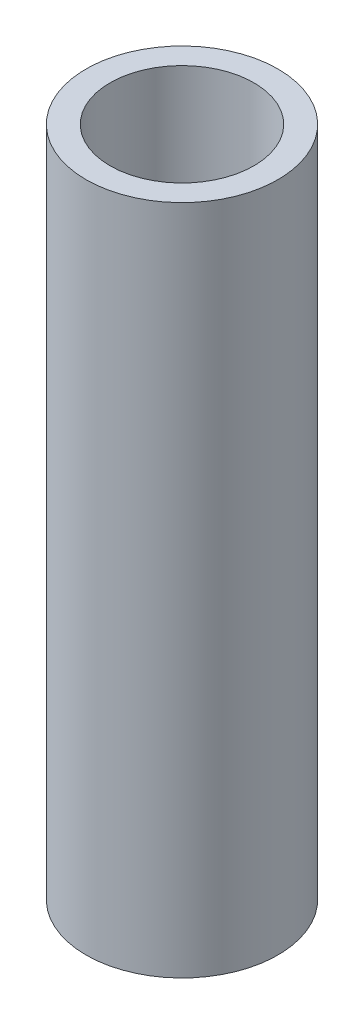
ISO-10303-21;
HEADER;
FILE_DESCRIPTION(('STEP AP214'),'2;1');
FILE_NAME('part.step','',(''),(''),'','','');
FILE_SCHEMA(('AUTOMOTIVE_DESIGN { 1 0 10303 214 1 1 1 1 }'));
ENDSEC;
DATA;
#1=APPLICATION_CONTEXT('core data for automotive mechanical design processes');
#2=APPLICATION_PROTOCOL_DEFINITION('international standard','automotive_design',2000,#1);
#3=PRODUCT_CONTEXT('',#1,'mechanical');
#4=PRODUCT('Part','Part','',(#3));
#5=PRODUCT_RELATED_PRODUCT_CATEGORY('part','',(#4));
#6=PRODUCT_DEFINITION_FORMATION('','',#4);
#7=PRODUCT_DEFINITION_CONTEXT('part definition',#1,'design');
#8=PRODUCT_DEFINITION('design','',#6,#7);
#9=PRODUCT_DEFINITION_SHAPE('','',#8);
#10=(LENGTH_UNIT() NAMED_UNIT(*) SI_UNIT(.MILLI.,.METRE.));
#11=(NAMED_UNIT(*) PLANE_ANGLE_UNIT() SI_UNIT($,.RADIAN.));
#12=(NAMED_UNIT(*) SI_UNIT($,.STERADIAN.) SOLID_ANGLE_UNIT());
#13=UNCERTAINTY_MEASURE_WITH_UNIT(LENGTH_MEASURE(1.E-05),#10,'distance_accuracy_value','');
#14=(GEOMETRIC_REPRESENTATION_CONTEXT(3) GLOBAL_UNCERTAINTY_ASSIGNED_CONTEXT((#13)) GLOBAL_UNIT_ASSIGNED_CONTEXT((#10,
#11,#12)) REPRESENTATION_CONTEXT('',''));
#15=CARTESIAN_POINT('',(0.,0.,0.));
#16=DIRECTION('',(0.,0.,1.));
#17=DIRECTION('',(1.,0.,0.));
#18=AXIS2_PLACEMENT_3D('',#15,#16,#17);
#19=CARTESIAN_POINT('',(-14.5675561179814,88.9,0.));
#20=DIRECTION('',(0.,1.,0.));
#21=DIRECTION('',(0.,0.,1.));
#22=AXIS2_PLACEMENT_3D('',#19,#20,#21);
#23=PLANE('',#22);
#24=CARTESIAN_POINT('',(-14.5675561179814,88.9,0.));
#25=DIRECTION('',(0.,1.,0.));
#26=DIRECTION('',(0.,0.,1.));
#27=AXIS2_PLACEMENT_3D('',#24,#25,#26);
#28=CIRCLE('',#27,12.7);
#29=CARTESIAN_POINT('',(-14.5675561179814,88.9,12.7));
#30=VERTEX_POINT('',#29);
#31=EDGE_CURVE('E10',#30,#30,#28,.T.);
#32=ORIENTED_EDGE('',*,*,#31,.T.);
#33=EDGE_LOOP('',(#32));
#34=FACE_BOUND('',#33,.T.);
#35=CARTESIAN_POINT('',(-14.5675561179814,88.9,0.));
#36=DIRECTION('',(0.,1.,0.));
#37=DIRECTION('',(0.,0.,1.));
#38=AXIS2_PLACEMENT_3D('',#35,#36,#37);
#39=CIRCLE('',#38,9.525);
#40=CARTESIAN_POINT('',(-14.5675561179814,88.9,9.525));
#41=VERTEX_POINT('',#40);
#42=EDGE_CURVE('E41',#41,#41,#39,.T.);
#43=ORIENTED_EDGE('',*,*,#42,.F.);
#44=EDGE_LOOP('',(#43));
#45=FACE_BOUND('',#44,.T.);
#46=ADVANCED_FACE('F30',(#34,#45),#23,.T.);
#47=CARTESIAN_POINT('',(-14.5675561179814,0.,0.));
#48=DIRECTION('',(0.,1.,0.));
#49=DIRECTION('',(0.,0.,1.));
#50=AXIS2_PLACEMENT_3D('',#47,#48,#49);
#51=PLANE('',#50);
#52=CARTESIAN_POINT('',(-14.5675561179814,0.,0.));
#53=DIRECTION('',(0.,1.,0.));
#54=DIRECTION('',(0.,0.,1.));
#55=AXIS2_PLACEMENT_3D('',#52,#53,#54);
#56=CIRCLE('',#55,12.7);
#57=CARTESIAN_POINT('',(-14.5675561179814,0.,12.7));
#58=VERTEX_POINT('',#57);
#59=EDGE_CURVE('E34',#58,#58,#56,.T.);
#60=ORIENTED_EDGE('',*,*,#59,.F.);
#61=EDGE_LOOP('',(#60));
#62=FACE_BOUND('',#61,.T.);
#63=CARTESIAN_POINT('',(-14.5675561179814,0.,0.));
#64=DIRECTION('',(0.,1.,0.));
#65=DIRECTION('',(0.,0.,1.));
#66=AXIS2_PLACEMENT_3D('',#63,#64,#65);
#67=CIRCLE('',#66,9.525);
#68=CARTESIAN_POINT('',(-14.5675561179814,0.,9.525));
#69=VERTEX_POINT('',#68);
#70=EDGE_CURVE('E43',#69,#69,#67,.T.);
#71=ORIENTED_EDGE('',*,*,#70,.T.);
#72=EDGE_LOOP('',(#71));
#73=FACE_BOUND('',#72,.T.);
#74=ADVANCED_FACE('F53',(#62,#73),#51,.F.);
#75=CARTESIAN_POINT('',(-14.5675561179814,88.9,0.));
#76=DIRECTION('',(0.,-1.,0.));
#77=DIRECTION('',(0.,0.,-1.));
#78=AXIS2_PLACEMENT_3D('',#75,#76,#77);
#79=CYLINDRICAL_SURFACE('',#78,12.7);
#80=ORIENTED_EDGE('',*,*,#31,.F.);
#81=EDGE_LOOP('',(#80));
#82=FACE_BOUND('',#81,.T.);
#83=ORIENTED_EDGE('',*,*,#59,.T.);
#84=EDGE_LOOP('',(#83));
#85=FACE_BOUND('',#84,.T.);
#86=ADVANCED_FACE('F32',(#82,#85),#79,.T.);
#87=CARTESIAN_POINT('',(-14.5675561179814,88.9,0.));
#88=DIRECTION('',(0.,-1.,0.));
#89=DIRECTION('',(0.,0.,-1.));
#90=AXIS2_PLACEMENT_3D('',#87,#88,#89);
#91=CYLINDRICAL_SURFACE('',#90,9.525);
#92=ORIENTED_EDGE('',*,*,#42,.T.);
#93=EDGE_LOOP('',(#92));
#94=FACE_BOUND('',#93,.T.);
#95=ORIENTED_EDGE('',*,*,#70,.F.);
#96=EDGE_LOOP('',(#95));
#97=FACE_BOUND('',#96,.T.);
#98=ADVANCED_FACE('F49',(#94,#97),#91,.F.);
#99=CLOSED_SHELL('',(#46,#74,#86,#98));
#100=MANIFOLD_SOLID_BREP('B2',#99);
#101=ADVANCED_BREP_SHAPE_REPRESENTATION('',(#18,#100),#14);
#102=SHAPE_DEFINITION_REPRESENTATION(#9,#101);
ENDSEC;
END-ISO-10303-21;
